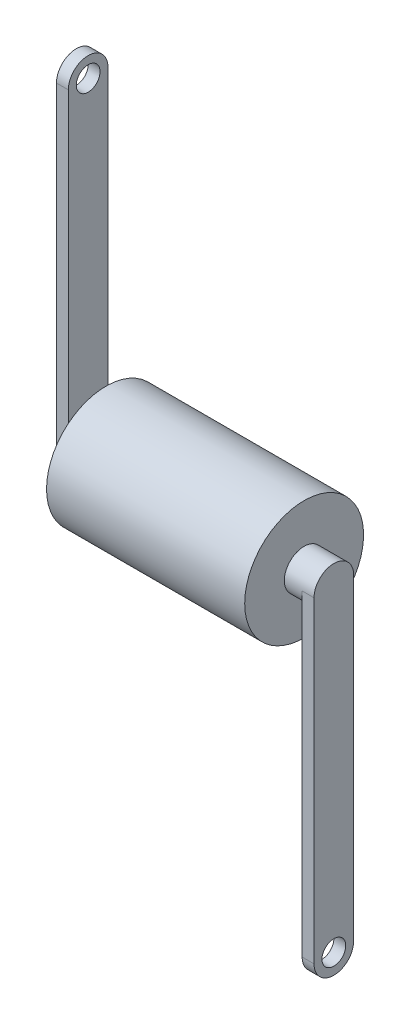
ISO-10303-21;
HEADER;
FILE_DESCRIPTION(('STEP AP214'),'2;1');
FILE_NAME('part.step','',(''),(''),'','','');
FILE_SCHEMA(('AUTOMOTIVE_DESIGN { 1 0 10303 214 1 1 1 1 }'));
ENDSEC;
DATA;
#1=APPLICATION_CONTEXT('core data for automotive mechanical design processes');
#2=APPLICATION_PROTOCOL_DEFINITION('international standard','automotive_design',2000,#1);
#3=PRODUCT_CONTEXT('',#1,'mechanical');
#4=PRODUCT('Part','Part','',(#3));
#5=PRODUCT_RELATED_PRODUCT_CATEGORY('part','',(#4));
#6=PRODUCT_DEFINITION_FORMATION('','',#4);
#7=PRODUCT_DEFINITION_CONTEXT('part definition',#1,'design');
#8=PRODUCT_DEFINITION('design','',#6,#7);
#9=PRODUCT_DEFINITION_SHAPE('','',#8);
#10=(LENGTH_UNIT() NAMED_UNIT(*) SI_UNIT(.MILLI.,.METRE.));
#11=(NAMED_UNIT(*) PLANE_ANGLE_UNIT() SI_UNIT($,.RADIAN.));
#12=(NAMED_UNIT(*) SI_UNIT($,.STERADIAN.) SOLID_ANGLE_UNIT());
#13=UNCERTAINTY_MEASURE_WITH_UNIT(LENGTH_MEASURE(1.E-05),#10,'distance_accuracy_value','');
#14=(GEOMETRIC_REPRESENTATION_CONTEXT(3) GLOBAL_UNCERTAINTY_ASSIGNED_CONTEXT((#13)) GLOBAL_UNIT_ASSIGNED_CONTEXT((#10,
#11,#12)) REPRESENTATION_CONTEXT('',''));
#15=CARTESIAN_POINT('',(0.,0.,0.));
#16=DIRECTION('',(0.,0.,1.));
#17=DIRECTION('',(1.,0.,0.));
#18=AXIS2_PLACEMENT_3D('',#15,#16,#17);
#19=CARTESIAN_POINT('',(25.,0.,0.));
#20=DIRECTION('',(-1.,0.,0.));
#21=DIRECTION('',(0.,0.,1.));
#22=AXIS2_PLACEMENT_3D('',#19,#20,#21);
#23=CYLINDRICAL_SURFACE('',#22,15.);
#24=CARTESIAN_POINT('',(25.,0.,0.));
#25=DIRECTION('',(1.,0.,0.));
#26=DIRECTION('',(0.,0.,-1.));
#27=AXIS2_PLACEMENT_3D('',#24,#25,#26);
#28=CIRCLE('',#27,15.);
#29=CARTESIAN_POINT('',(25.,0.,15.));
#30=VERTEX_POINT('',#29);
#31=EDGE_CURVE('E177',#30,#30,#28,.T.);
#32=CARTESIAN_POINT('',(-25.,0.,0.));
#33=DIRECTION('',(1.,0.,0.));
#34=DIRECTION('',(0.,0.,-1.));
#35=AXIS2_PLACEMENT_3D('',#32,#33,#34);
#36=CIRCLE('',#35,15.);
#37=CARTESIAN_POINT('',(-25.,0.,15.));
#38=VERTEX_POINT('',#37);
#39=EDGE_CURVE('E176',#38,#38,#36,.T.);
#40=CARTESIAN_POINT('',(25.,0.,15.));
#41=CARTESIAN_POINT('',(24.4791666666667,0.,15.));
#42=CARTESIAN_POINT('',(23.9583333333333,0.,15.));
#43=CARTESIAN_POINT('',(22.9166666666667,0.,15.));
#44=CARTESIAN_POINT('',(22.3958333333333,0.,15.));
#45=CARTESIAN_POINT('',(21.3541666666667,0.,15.));
#46=CARTESIAN_POINT('',(20.8333333333333,0.,15.));
#47=CARTESIAN_POINT('',(19.7916666666667,0.,15.));
#48=CARTESIAN_POINT('',(19.2708333333333,0.,15.));
#49=CARTESIAN_POINT('',(18.2291666666667,0.,15.));
#50=CARTESIAN_POINT('',(17.7083333333333,0.,15.));
#51=CARTESIAN_POINT('',(16.6666666666667,0.,15.));
#52=CARTESIAN_POINT('',(16.1458333333333,0.,15.));
#53=CARTESIAN_POINT('',(15.1041666666667,0.,15.));
#54=CARTESIAN_POINT('',(14.5833333333333,0.,15.));
#55=CARTESIAN_POINT('',(13.5416666666667,0.,15.));
#56=CARTESIAN_POINT('',(13.0208333333333,0.,15.));
#57=CARTESIAN_POINT('',(11.9791666666667,0.,15.));
#58=CARTESIAN_POINT('',(11.4583333333333,0.,15.));
#59=CARTESIAN_POINT('',(10.4166666666667,0.,15.));
#60=CARTESIAN_POINT('',(9.89583333333333,0.,15.));
#61=CARTESIAN_POINT('',(8.85416666666666,0.,15.));
#62=CARTESIAN_POINT('',(8.33333333333333,0.,15.));
#63=CARTESIAN_POINT('',(7.29166666666666,0.,15.));
#64=CARTESIAN_POINT('',(6.77083333333333,0.,15.));
#65=CARTESIAN_POINT('',(5.72916666666666,0.,15.));
#66=CARTESIAN_POINT('',(5.20833333333333,0.,15.));
#67=CARTESIAN_POINT('',(4.16666666666666,0.,15.));
#68=CARTESIAN_POINT('',(3.64583333333333,0.,15.));
#69=CARTESIAN_POINT('',(2.60416666666666,0.,15.));
#70=CARTESIAN_POINT('',(2.08333333333333,0.,15.));
#71=CARTESIAN_POINT('',(1.04166666666666,0.,15.));
#72=CARTESIAN_POINT('',(0.52083333333333,0.,15.));
#73=CARTESIAN_POINT('',(-0.520833333333337,0.,15.));
#74=CARTESIAN_POINT('',(-1.04166666666667,0.,15.));
#75=CARTESIAN_POINT('',(-2.08333333333334,0.,15.));
#76=CARTESIAN_POINT('',(-2.60416666666667,0.,15.));
#77=CARTESIAN_POINT('',(-3.64583333333334,0.,15.));
#78=CARTESIAN_POINT('',(-4.16666666666667,0.,15.));
#79=CARTESIAN_POINT('',(-5.20833333333334,0.,15.));
#80=CARTESIAN_POINT('',(-5.72916666666667,0.,15.));
#81=CARTESIAN_POINT('',(-6.77083333333333,0.,15.));
#82=CARTESIAN_POINT('',(-7.29166666666666,0.,15.));
#83=CARTESIAN_POINT('',(-8.33333333333333,0.,15.));
#84=CARTESIAN_POINT('',(-8.85416666666666,0.,15.));
#85=CARTESIAN_POINT('',(-9.89583333333333,0.,15.));
#86=CARTESIAN_POINT('',(-10.4166666666667,0.,15.));
#87=CARTESIAN_POINT('',(-11.4583333333333,0.,15.));
#88=CARTESIAN_POINT('',(-11.9791666666667,0.,15.));
#89=CARTESIAN_POINT('',(-13.0208333333333,0.,15.));
#90=CARTESIAN_POINT('',(-13.5416666666667,0.,15.));
#91=CARTESIAN_POINT('',(-14.5833333333333,0.,15.));
#92=CARTESIAN_POINT('',(-15.1041666666667,0.,15.));
#93=CARTESIAN_POINT('',(-16.1458333333333,0.,15.));
#94=CARTESIAN_POINT('',(-16.6666666666667,0.,15.));
#95=CARTESIAN_POINT('',(-17.7083333333333,0.,15.));
#96=CARTESIAN_POINT('',(-18.2291666666667,0.,15.));
#97=CARTESIAN_POINT('',(-19.2708333333333,0.,15.));
#98=CARTESIAN_POINT('',(-19.7916666666667,0.,15.));
#99=CARTESIAN_POINT('',(-20.8333333333333,0.,15.));
#100=CARTESIAN_POINT('',(-21.3541666666667,0.,15.));
#101=CARTESIAN_POINT('',(-22.3958333333333,0.,15.));
#102=CARTESIAN_POINT('',(-22.9166666666667,0.,15.));
#103=CARTESIAN_POINT('',(-23.9583333333333,0.,15.));
#104=CARTESIAN_POINT('',(-24.4791666666667,0.,15.));
#105=CARTESIAN_POINT('',(-25.,0.,15.));
#106=B_SPLINE_CURVE_WITH_KNOTS('',3,(#40,#41,#42,#43,#44,#45,#46,#47,#48,#49,#50,#51,#52,#53,
#54,#55,#56,#57,#58,#59,#60,#61,#62,#63,#64,#65,#66,#67,#68,#69,#70,#71,#72,#73,#74,#75,#76,#77,
#78,#79,#80,#81,#82,#83,#84,#85,#86,#87,#88,#89,#90,#91,#92,#93,#94,#95,#96,#97,#98,#99,#100,
#101,#102,#103,#104,#105),.UNSPECIFIED.,.F.,.F.,(4,2,2,2,2,2,2,2,2,2,2,2,2,2,2,2,2,2,2,2,2,2,2,
2,2,2,2,2,2,2,2,2,4),(0.,1.5625,3.125,4.6875,6.25,7.8125,9.375,10.9375,12.5,14.0625,15.625,
17.1875,18.75,20.3125,21.875,23.4375,25.,26.5625,28.125,29.6875,31.25,32.8125,34.375,35.9375,
37.5,39.0625,40.625,42.1875,43.75,45.3125,46.875,48.4375,50.),.UNSPECIFIED.);
#107=EDGE_CURVE('BSEAM39',#30,#38,#106,.T.);
#108=ORIENTED_EDGE('',*,*,#31,.F.);
#109=ORIENTED_EDGE('',*,*,#39,.T.);
#110=ORIENTED_EDGE('',*,*,#107,.T.);
#111=ORIENTED_EDGE('',*,*,#107,.F.);
#112=EDGE_LOOP('',(#108,#110,#109,#111));
#113=FACE_BOUND('',#112,.T.);
#114=ADVANCED_FACE('F39',(#113),#23,.T.);
#115=CARTESIAN_POINT('',(25.,0.,0.));
#116=DIRECTION('',(1.,0.,0.));
#117=DIRECTION('',(0.,0.,-1.));
#118=AXIS2_PLACEMENT_3D('',#115,#116,#117);
#119=PLANE('',#118);
#120=CARTESIAN_POINT('',(25.,0.,0.));
#121=DIRECTION('',(1.,0.,0.));
#122=DIRECTION('',(0.,0.,-1.));
#123=AXIS2_PLACEMENT_3D('',#120,#121,#122);
#124=CIRCLE('',#123,5.);
#125=CARTESIAN_POINT('',(25.,0.,-5.));
#126=VERTEX_POINT('',#125);
#127=EDGE_CURVE('E172',#126,#126,#124,.F.);
#128=ORIENTED_EDGE('',*,*,#127,.T.);
#129=EDGE_LOOP('',(#128));
#130=FACE_BOUND('',#129,.T.);
#131=ORIENTED_EDGE('',*,*,#31,.T.);
#132=EDGE_LOOP('',(#131));
#133=FACE_BOUND('',#132,.T.);
#134=ADVANCED_FACE('F216',(#130,#133),#119,.T.);
#135=CARTESIAN_POINT('',(-25.,0.,0.));
#136=DIRECTION('',(1.,0.,0.));
#137=DIRECTION('',(0.,0.,-1.));
#138=AXIS2_PLACEMENT_3D('',#135,#136,#137);
#139=PLANE('',#138);
#140=CARTESIAN_POINT('',(-25.,0.,0.));
#141=DIRECTION('',(1.,0.,0.));
#142=DIRECTION('',(0.,0.,-1.));
#143=AXIS2_PLACEMENT_3D('',#140,#141,#142);
#144=CIRCLE('',#143,5.);
#145=CARTESIAN_POINT('',(-25.,0.,-5.));
#146=VERTEX_POINT('',#145);
#147=EDGE_CURVE('E180',#146,#146,#144,.F.);
#148=ORIENTED_EDGE('',*,*,#147,.F.);
#149=EDGE_LOOP('',(#148));
#150=FACE_BOUND('',#149,.T.);
#151=ORIENTED_EDGE('',*,*,#39,.F.);
#152=EDGE_LOOP('',(#151));
#153=FACE_BOUND('',#152,.T.);
#154=ADVANCED_FACE('F222',(#150,#153),#139,.F.);
#155=CARTESIAN_POINT('',(-32.5,0.,0.));
#156=DIRECTION('',(1.,0.,0.));
#157=DIRECTION('',(0.,0.,-1.));
#158=AXIS2_PLACEMENT_3D('',#155,#156,#157);
#159=PLANE('',#158);
#160=CARTESIAN_POINT('',(-32.5,0.,0.));
#161=DIRECTION('',(1.,0.,0.));
#162=DIRECTION('',(0.,0.,-1.));
#163=AXIS2_PLACEMENT_3D('',#160,#161,#162);
#164=CIRCLE('',#163,5.);
#165=CARTESIAN_POINT('',(-32.5,0.,5.));
#166=VERTEX_POINT('',#165);
#167=CARTESIAN_POINT('',(-32.5,0.,-5.));
#168=VERTEX_POINT('',#167);
#169=EDGE_CURVE('E162',#166,#168,#164,.T.);
#170=ORIENTED_EDGE('',*,*,#169,.F.);
#171=DIRECTION('',(0.,1.,0.));
#172=VECTOR('',#171,1.);
#173=CARTESIAN_POINT('',(-32.5,0.,5.));
#174=LINE('',#173,#172);
#175=CARTESIAN_POINT('',(-32.5,80.,5.));
#176=VERTEX_POINT('',#175);
#177=EDGE_CURVE('E129',#166,#176,#174,.T.);
#178=ORIENTED_EDGE('',*,*,#177,.T.);
#179=CARTESIAN_POINT('',(-32.5,80.,0.));
#180=DIRECTION('',(-1.,0.,0.));
#181=DIRECTION('',(0.,0.,1.));
#182=AXIS2_PLACEMENT_3D('',#179,#180,#181);
#183=CIRCLE('',#182,5.);
#184=CARTESIAN_POINT('',(-32.5,80.,-5.));
#185=VERTEX_POINT('',#184);
#186=EDGE_CURVE('E106',#176,#185,#183,.T.);
#187=ORIENTED_EDGE('',*,*,#186,.T.);
#188=DIRECTION('',(0.,-1.,0.));
#189=VECTOR('',#188,1.);
#190=CARTESIAN_POINT('',(-32.5,0.,-5.));
#191=LINE('',#190,#189);
#192=EDGE_CURVE('E126',#185,#168,#191,.T.);
#193=ORIENTED_EDGE('',*,*,#192,.T.);
#194=EDGE_LOOP('',(#170,#178,#187,#193));
#195=FACE_BOUND('',#194,.T.);
#196=CARTESIAN_POINT('',(-32.5,80.,0.));
#197=DIRECTION('',(-1.,0.,0.));
#198=DIRECTION('',(0.,0.,1.));
#199=AXIS2_PLACEMENT_3D('',#196,#197,#198);
#200=CIRCLE('',#199,3.00000000000001);
#201=CARTESIAN_POINT('',(-32.5,80.,3.));
#202=VERTEX_POINT('',#201);
#203=EDGE_CURVE('E374',#202,#202,#200,.T.);
#204=ORIENTED_EDGE('',*,*,#203,.F.);
#205=EDGE_LOOP('',(#204));
#206=FACE_BOUND('',#205,.T.);
#207=ADVANCED_FACE('F230',(#195,#206),#159,.F.);
#208=CARTESIAN_POINT('',(32.5,0.,0.));
#209=DIRECTION('',(-1.,0.,0.));
#210=DIRECTION('',(0.,0.,1.));
#211=AXIS2_PLACEMENT_3D('',#208,#209,#210);
#212=CYLINDRICAL_SURFACE('',#211,5.);
#213=CARTESIAN_POINT('',(-29.5,0.,0.));
#214=DIRECTION('',(-1.,0.,0.));
#215=DIRECTION('',(0.,0.,1.));
#216=AXIS2_PLACEMENT_3D('',#213,#214,#215);
#217=CIRCLE('',#216,5.);
#218=CARTESIAN_POINT('',(-29.5,0.,5.));
#219=VERTEX_POINT('',#218);
#220=CARTESIAN_POINT('',(-29.5,0.,-5.));
#221=VERTEX_POINT('',#220);
#222=EDGE_CURVE('E11',#219,#221,#217,.T.);
#223=ORIENTED_EDGE('',*,*,#222,.F.);
#224=DIRECTION('',(-1.,0.,0.));
#225=VECTOR('',#224,1.);
#226=CARTESIAN_POINT('',(-29.5,0.,5.));
#227=LINE('',#226,#225);
#228=EDGE_CURVE('E111',#219,#166,#227,.T.);
#229=ORIENTED_EDGE('',*,*,#228,.T.);
#230=ORIENTED_EDGE('',*,*,#169,.T.);
#231=DIRECTION('',(-1.,0.,0.));
#232=VECTOR('',#231,1.);
#233=CARTESIAN_POINT('',(-29.5,0.,-5.));
#234=LINE('',#233,#232);
#235=EDGE_CURVE('E53',#221,#168,#234,.T.);
#236=ORIENTED_EDGE('',*,*,#235,.F.);
#237=EDGE_LOOP('',(#223,#229,#230,#236));
#238=FACE_BOUND('',#237,.T.);
#239=ORIENTED_EDGE('',*,*,#147,.T.);
#240=EDGE_LOOP('',(#239));
#241=FACE_BOUND('',#240,.T.);
#242=ADVANCED_FACE('F237',(#238,#241),#212,.T.);
#243=ORIENTED_EDGE('',*,*,#127,.F.);
#244=EDGE_LOOP('',(#243));
#245=FACE_BOUND('',#244,.T.);
#246=CARTESIAN_POINT('',(29.5,0.,0.));
#247=DIRECTION('',(1.,0.,0.));
#248=DIRECTION('',(0.,0.,-1.));
#249=AXIS2_PLACEMENT_3D('',#246,#247,#248);
#250=CIRCLE('',#249,5.);
#251=CARTESIAN_POINT('',(29.5,0.,5.));
#252=VERTEX_POINT('',#251);
#253=CARTESIAN_POINT('',(29.5,0.,-5.));
#254=VERTEX_POINT('',#253);
#255=EDGE_CURVE('E46',#252,#254,#250,.T.);
#256=ORIENTED_EDGE('',*,*,#255,.F.);
#257=DIRECTION('',(1.,0.,0.));
#258=VECTOR('',#257,1.);
#259=CARTESIAN_POINT('',(29.5,0.,5.));
#260=LINE('',#259,#258);
#261=CARTESIAN_POINT('',(32.5,0.,5.));
#262=VERTEX_POINT('',#261);
#263=EDGE_CURVE('E159',#252,#262,#260,.T.);
#264=ORIENTED_EDGE('',*,*,#263,.T.);
#265=CARTESIAN_POINT('',(32.5,0.,0.));
#266=DIRECTION('',(1.,0.,0.));
#267=DIRECTION('',(0.,0.,-1.));
#268=AXIS2_PLACEMENT_3D('',#265,#266,#267);
#269=CIRCLE('',#268,5.);
#270=CARTESIAN_POINT('',(32.5,0.,-5.));
#271=VERTEX_POINT('',#270);
#272=EDGE_CURVE('E169',#271,#262,#269,.T.);
#273=ORIENTED_EDGE('',*,*,#272,.F.);
#274=DIRECTION('',(1.,0.,0.));
#275=VECTOR('',#274,1.);
#276=CARTESIAN_POINT('',(29.5,0.,-5.));
#277=LINE('',#276,#275);
#278=EDGE_CURVE('E163',#254,#271,#277,.T.);
#279=ORIENTED_EDGE('',*,*,#278,.F.);
#280=EDGE_LOOP('',(#256,#264,#273,#279));
#281=FACE_BOUND('',#280,.T.);
#282=ADVANCED_FACE('F196',(#245,#281),#212,.T.);
#283=CARTESIAN_POINT('',(32.5,0.,0.));
#284=DIRECTION('',(1.,0.,0.));
#285=DIRECTION('',(0.,0.,-1.));
#286=AXIS2_PLACEMENT_3D('',#283,#284,#285);
#287=PLANE('',#286);
#288=ORIENTED_EDGE('',*,*,#272,.T.);
#289=DIRECTION('',(0.,-1.,0.));
#290=VECTOR('',#289,1.);
#291=CARTESIAN_POINT('',(32.5,0.,5.));
#292=LINE('',#291,#290);
#293=CARTESIAN_POINT('',(32.5,-80.,4.99999999999999));
#294=VERTEX_POINT('',#293);
#295=EDGE_CURVE('E139',#262,#294,#292,.T.);
#296=ORIENTED_EDGE('',*,*,#295,.T.);
#297=CARTESIAN_POINT('',(32.5,-80.,0.));
#298=DIRECTION('',(1.,0.,0.));
#299=DIRECTION('',(0.,0.,-1.));
#300=AXIS2_PLACEMENT_3D('',#297,#298,#299);
#301=CIRCLE('',#300,4.99999999999999);
#302=CARTESIAN_POINT('',(32.5,-80.,-4.99999999999999));
#303=VERTEX_POINT('',#302);
#304=EDGE_CURVE('E155',#294,#303,#301,.T.);
#305=ORIENTED_EDGE('',*,*,#304,.T.);
#306=DIRECTION('',(0.,1.,0.));
#307=VECTOR('',#306,1.);
#308=CARTESIAN_POINT('',(32.5,0.,-5.));
#309=LINE('',#308,#307);
#310=EDGE_CURVE('E146',#303,#271,#309,.T.);
#311=ORIENTED_EDGE('',*,*,#310,.T.);
#312=EDGE_LOOP('',(#288,#296,#305,#311));
#313=FACE_BOUND('',#312,.T.);
#314=CARTESIAN_POINT('',(32.5,-80.,0.));
#315=DIRECTION('',(1.,0.,0.));
#316=DIRECTION('',(0.,0.,-1.));
#317=AXIS2_PLACEMENT_3D('',#314,#315,#316);
#318=CIRCLE('',#317,3.00000000000001);
#319=CARTESIAN_POINT('',(32.5,-80.,-3.00000000000001));
#320=VERTEX_POINT('',#319);
#321=EDGE_CURVE('E133',#320,#320,#318,.T.);
#322=ORIENTED_EDGE('',*,*,#321,.F.);
#323=EDGE_LOOP('',(#322));
#324=FACE_BOUND('',#323,.T.);
#325=ADVANCED_FACE('F198',(#313,#324),#287,.T.);
#326=CARTESIAN_POINT('',(29.5,0.,5.));
#327=DIRECTION('',(0.,0.,1.));
#328=DIRECTION('',(0.,-1.,0.));
#329=AXIS2_PLACEMENT_3D('',#326,#327,#328);
#330=PLANE('',#329);
#331=ORIENTED_EDGE('',*,*,#295,.F.);
#332=ORIENTED_EDGE('',*,*,#263,.F.);
#333=DIRECTION('',(0.,-1.,0.));
#334=VECTOR('',#333,1.);
#335=CARTESIAN_POINT('',(29.5,0.,5.));
#336=LINE('',#335,#334);
#337=CARTESIAN_POINT('',(29.5,-80.,4.99999999999999));
#338=VERTEX_POINT('',#337);
#339=EDGE_CURVE('E142',#252,#338,#336,.T.);
#340=ORIENTED_EDGE('',*,*,#339,.T.);
#341=DIRECTION('',(1.,0.,0.));
#342=VECTOR('',#341,1.);
#343=CARTESIAN_POINT('',(29.5,-80.,4.99999999999999));
#344=LINE('',#343,#342);
#345=EDGE_CURVE('E152',#338,#294,#344,.T.);
#346=ORIENTED_EDGE('',*,*,#345,.T.);
#347=EDGE_LOOP('',(#331,#332,#340,#346));
#348=FACE_BOUND('',#347,.T.);
#349=ADVANCED_FACE('F204',(#348),#330,.T.);
#350=CARTESIAN_POINT('',(29.5,0.,-5.));
#351=DIRECTION('',(0.,0.,-1.));
#352=DIRECTION('',(0.,1.,0.));
#353=AXIS2_PLACEMENT_3D('',#350,#351,#352);
#354=PLANE('',#353);
#355=ORIENTED_EDGE('',*,*,#310,.F.);
#356=DIRECTION('',(1.,0.,0.));
#357=VECTOR('',#356,1.);
#358=CARTESIAN_POINT('',(29.5,-80.,-4.99999999999999));
#359=LINE('',#358,#357);
#360=CARTESIAN_POINT('',(29.5,-80.,-4.99999999999999));
#361=VERTEX_POINT('',#360);
#362=EDGE_CURVE('E166',#361,#303,#359,.T.);
#363=ORIENTED_EDGE('',*,*,#362,.F.);
#364=DIRECTION('',(0.,1.,0.));
#365=VECTOR('',#364,1.);
#366=CARTESIAN_POINT('',(29.5,0.,-5.));
#367=LINE('',#366,#365);
#368=EDGE_CURVE('E149',#361,#254,#367,.T.);
#369=ORIENTED_EDGE('',*,*,#368,.T.);
#370=ORIENTED_EDGE('',*,*,#278,.T.);
#371=EDGE_LOOP('',(#355,#363,#369,#370));
#372=FACE_BOUND('',#371,.T.);
#373=ADVANCED_FACE('F194',(#372),#354,.T.);
#374=CARTESIAN_POINT('',(29.5,-80.,0.));
#375=DIRECTION('',(1.,0.,0.));
#376=DIRECTION('',(0.,0.,-1.));
#377=AXIS2_PLACEMENT_3D('',#374,#375,#376);
#378=CYLINDRICAL_SURFACE('',#377,4.99999999999999);
#379=ORIENTED_EDGE('',*,*,#304,.F.);
#380=ORIENTED_EDGE('',*,*,#345,.F.);
#381=CARTESIAN_POINT('',(29.5,-80.,0.));
#382=DIRECTION('',(1.,0.,0.));
#383=DIRECTION('',(0.,0.,-1.));
#384=AXIS2_PLACEMENT_3D('',#381,#382,#383);
#385=CIRCLE('',#384,4.99999999999999);
#386=EDGE_CURVE('E145',#338,#361,#385,.T.);
#387=ORIENTED_EDGE('',*,*,#386,.T.);
#388=ORIENTED_EDGE('',*,*,#362,.T.);
#389=EDGE_LOOP('',(#379,#380,#387,#388));
#390=FACE_BOUND('',#389,.T.);
#391=ADVANCED_FACE('F202',(#390),#378,.T.);
#392=CARTESIAN_POINT('',(29.5,-80.,0.));
#393=DIRECTION('',(1.,0.,0.));
#394=DIRECTION('',(0.,0.,-1.));
#395=AXIS2_PLACEMENT_3D('',#392,#393,#394);
#396=PLANE('',#395);
#397=CARTESIAN_POINT('',(29.5,-80.,0.));
#398=DIRECTION('',(1.,0.,0.));
#399=DIRECTION('',(0.,0.,-1.));
#400=AXIS2_PLACEMENT_3D('',#397,#398,#399);
#401=CIRCLE('',#400,3.00000000000001);
#402=CARTESIAN_POINT('',(29.5,-80.,-3.00000000000001));
#403=VERTEX_POINT('',#402);
#404=EDGE_CURVE('E136',#403,#403,#401,.T.);
#405=ORIENTED_EDGE('',*,*,#404,.T.);
#406=EDGE_LOOP('',(#405));
#407=FACE_BOUND('',#406,.T.);
#408=ORIENTED_EDGE('',*,*,#339,.F.);
#409=ORIENTED_EDGE('',*,*,#255,.T.);
#410=ORIENTED_EDGE('',*,*,#368,.F.);
#411=ORIENTED_EDGE('',*,*,#386,.F.);
#412=EDGE_LOOP('',(#408,#409,#410,#411));
#413=FACE_BOUND('',#412,.T.);
#414=ADVANCED_FACE('F188',(#407,#413),#396,.F.);
#415=CARTESIAN_POINT('',(29.5,-80.,0.));
#416=DIRECTION('',(1.,0.,0.));
#417=DIRECTION('',(0.,0.,-1.));
#418=AXIS2_PLACEMENT_3D('',#415,#416,#417);
#419=CYLINDRICAL_SURFACE('',#418,3.00000000000001);
#420=ORIENTED_EDGE('',*,*,#404,.F.);
#421=EDGE_LOOP('',(#420));
#422=FACE_BOUND('',#421,.T.);
#423=ORIENTED_EDGE('',*,*,#321,.T.);
#424=EDGE_LOOP('',(#423));
#425=FACE_BOUND('',#424,.T.);
#426=ADVANCED_FACE('F274',(#422,#425),#419,.F.);
#427=CARTESIAN_POINT('',(-29.5,0.,-5.));
#428=DIRECTION('',(0.,0.,-1.));
#429=DIRECTION('',(-1.,0.,0.));
#430=AXIS2_PLACEMENT_3D('',#427,#428,#429);
#431=PLANE('',#430);
#432=ORIENTED_EDGE('',*,*,#192,.F.);
#433=DIRECTION('',(-1.,0.,0.));
#434=VECTOR('',#433,1.);
#435=CARTESIAN_POINT('',(-29.5,80.,-5.));
#436=LINE('',#435,#434);
#437=CARTESIAN_POINT('',(-29.5,80.,-5.));
#438=VERTEX_POINT('',#437);
#439=EDGE_CURVE('E110',#438,#185,#436,.T.);
#440=ORIENTED_EDGE('',*,*,#439,.F.);
#441=DIRECTION('',(0.,-1.,0.));
#442=VECTOR('',#441,1.);
#443=CARTESIAN_POINT('',(-29.5,0.,-5.));
#444=LINE('',#443,#442);
#445=EDGE_CURVE('E117',#438,#221,#444,.T.);
#446=ORIENTED_EDGE('',*,*,#445,.T.);
#447=ORIENTED_EDGE('',*,*,#235,.T.);
#448=EDGE_LOOP('',(#432,#440,#446,#447));
#449=FACE_BOUND('',#448,.T.);
#450=ADVANCED_FACE('F278',(#449),#431,.T.);
#451=CARTESIAN_POINT('',(-29.5,80.,0.));
#452=DIRECTION('',(-1.,0.,0.));
#453=DIRECTION('',(0.,0.,1.));
#454=AXIS2_PLACEMENT_3D('',#451,#452,#453);
#455=CYLINDRICAL_SURFACE('',#454,5.);
#456=ORIENTED_EDGE('',*,*,#186,.F.);
#457=DIRECTION('',(-1.,0.,0.));
#458=VECTOR('',#457,1.);
#459=CARTESIAN_POINT('',(-29.5,80.,5.));
#460=LINE('',#459,#458);
#461=CARTESIAN_POINT('',(-29.5,80.,5.));
#462=VERTEX_POINT('',#461);
#463=EDGE_CURVE('E100',#462,#176,#460,.T.);
#464=ORIENTED_EDGE('',*,*,#463,.F.);
#465=CARTESIAN_POINT('',(-29.5,80.,0.));
#466=DIRECTION('',(-1.,0.,0.));
#467=DIRECTION('',(0.,0.,1.));
#468=AXIS2_PLACEMENT_3D('',#465,#466,#467);
#469=CIRCLE('',#468,5.);
#470=EDGE_CURVE('E104',#462,#438,#469,.T.);
#471=ORIENTED_EDGE('',*,*,#470,.T.);
#472=ORIENTED_EDGE('',*,*,#439,.T.);
#473=EDGE_LOOP('',(#456,#464,#471,#472));
#474=FACE_BOUND('',#473,.T.);
#475=ADVANCED_FACE('F102',(#474),#455,.T.);
#476=CARTESIAN_POINT('',(-29.5,0.,5.));
#477=DIRECTION('',(0.,0.,1.));
#478=DIRECTION('',(1.,0.,0.));
#479=AXIS2_PLACEMENT_3D('',#476,#477,#478);
#480=PLANE('',#479);
#481=ORIENTED_EDGE('',*,*,#177,.F.);
#482=ORIENTED_EDGE('',*,*,#228,.F.);
#483=DIRECTION('',(0.,1.,0.));
#484=VECTOR('',#483,1.);
#485=CARTESIAN_POINT('',(-29.5,0.,5.));
#486=LINE('',#485,#484);
#487=EDGE_CURVE('E114',#219,#462,#486,.T.);
#488=ORIENTED_EDGE('',*,*,#487,.T.);
#489=ORIENTED_EDGE('',*,*,#463,.T.);
#490=EDGE_LOOP('',(#481,#482,#488,#489));
#491=FACE_BOUND('',#490,.T.);
#492=ADVANCED_FACE('F115',(#491),#480,.T.);
#493=CARTESIAN_POINT('',(-29.5,80.,0.));
#494=DIRECTION('',(-1.,0.,0.));
#495=DIRECTION('',(0.,0.,1.));
#496=AXIS2_PLACEMENT_3D('',#493,#494,#495);
#497=PLANE('',#496);
#498=CARTESIAN_POINT('',(-29.5,80.,0.));
#499=DIRECTION('',(-1.,0.,0.));
#500=DIRECTION('',(0.,0.,1.));
#501=AXIS2_PLACEMENT_3D('',#498,#499,#500);
#502=CIRCLE('',#501,3.00000000000001);
#503=CARTESIAN_POINT('',(-29.5,80.,3.));
#504=VERTEX_POINT('',#503);
#505=EDGE_CURVE('E130',#504,#504,#502,.T.);
#506=ORIENTED_EDGE('',*,*,#505,.T.);
#507=EDGE_LOOP('',(#506));
#508=FACE_BOUND('',#507,.T.);
#509=ORIENTED_EDGE('',*,*,#487,.F.);
#510=ORIENTED_EDGE('',*,*,#222,.T.);
#511=ORIENTED_EDGE('',*,*,#445,.F.);
#512=ORIENTED_EDGE('',*,*,#470,.F.);
#513=EDGE_LOOP('',(#509,#510,#511,#512));
#514=FACE_BOUND('',#513,.T.);
#515=ADVANCED_FACE('F120',(#508,#514),#497,.F.);
#516=CARTESIAN_POINT('',(-29.5,80.,0.));
#517=DIRECTION('',(-1.,0.,0.));
#518=DIRECTION('',(0.,0.,1.));
#519=AXIS2_PLACEMENT_3D('',#516,#517,#518);
#520=CYLINDRICAL_SURFACE('',#519,3.00000000000001);
#521=ORIENTED_EDGE('',*,*,#505,.F.);
#522=EDGE_LOOP('',(#521));
#523=FACE_BOUND('',#522,.T.);
#524=ORIENTED_EDGE('',*,*,#203,.T.);
#525=EDGE_LOOP('',(#524));
#526=FACE_BOUND('',#525,.T.);
#527=ADVANCED_FACE('F317',(#523,#526),#520,.F.);
#528=CLOSED_SHELL('',(#114,#134,#154,#207,#242,#282,#325,#349,#373,#391,#414,#426,#450,#475,
#492,#515,#527));
#529=MANIFOLD_SOLID_BREP('B2',#528);
#530=ADVANCED_BREP_SHAPE_REPRESENTATION('',(#18,#529),#14);
#531=SHAPE_DEFINITION_REPRESENTATION(#9,#530);
ENDSEC;
END-ISO-10303-21;
